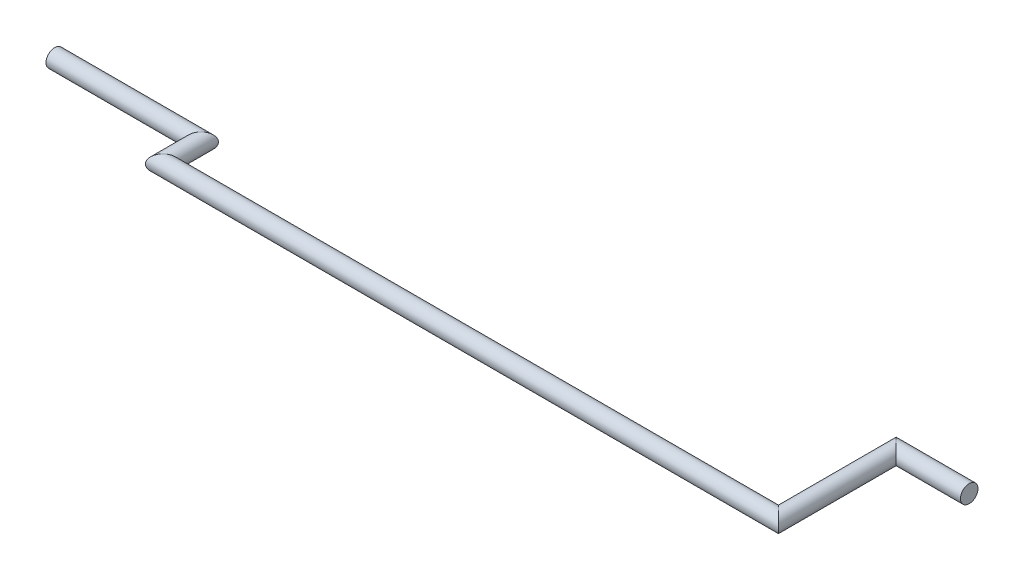
ISO-10303-21;
HEADER;
FILE_DESCRIPTION(('STEP AP214'),'2;1');
FILE_NAME('part.step','',(''),(''),'','','');
FILE_SCHEMA(('AUTOMOTIVE_DESIGN { 1 0 10303 214 1 1 1 1 }'));
ENDSEC;
DATA;
#1=APPLICATION_CONTEXT('core data for automotive mechanical design processes');
#2=APPLICATION_PROTOCOL_DEFINITION('international standard','automotive_design',2000,#1);
#3=PRODUCT_CONTEXT('',#1,'mechanical');
#4=PRODUCT('Part','Part','',(#3));
#5=PRODUCT_RELATED_PRODUCT_CATEGORY('part','',(#4));
#6=PRODUCT_DEFINITION_FORMATION('','',#4);
#7=PRODUCT_DEFINITION_CONTEXT('part definition',#1,'design');
#8=PRODUCT_DEFINITION('design','',#6,#7);
#9=PRODUCT_DEFINITION_SHAPE('','',#8);
#10=(LENGTH_UNIT() NAMED_UNIT(*) SI_UNIT(.MILLI.,.METRE.));
#11=(NAMED_UNIT(*) PLANE_ANGLE_UNIT() SI_UNIT($,.RADIAN.));
#12=(NAMED_UNIT(*) SI_UNIT($,.STERADIAN.) SOLID_ANGLE_UNIT());
#13=UNCERTAINTY_MEASURE_WITH_UNIT(LENGTH_MEASURE(1.E-05),#10,'distance_accuracy_value','');
#14=(GEOMETRIC_REPRESENTATION_CONTEXT(3) GLOBAL_UNCERTAINTY_ASSIGNED_CONTEXT((#13)) GLOBAL_UNIT_ASSIGNED_CONTEXT((#10,
#11,#12)) REPRESENTATION_CONTEXT('',''));
#15=CARTESIAN_POINT('',(0.,0.,0.));
#16=DIRECTION('',(0.,0.,1.));
#17=DIRECTION('',(1.,0.,0.));
#18=AXIS2_PLACEMENT_3D('',#15,#16,#17);
#19=CARTESIAN_POINT('',(47.11,0.,-8.05));
#20=DIRECTION('',(-1.,0.,0.));
#21=DIRECTION('',(0.,0.,1.));
#22=AXIS2_PLACEMENT_3D('',#19,#20,#21);
#23=PLANE('',#22);
#24=CARTESIAN_POINT('',(47.11,0.,-8.05));
#25=DIRECTION('',(-1.,0.,0.));
#26=DIRECTION('',(0.,0.,1.));
#27=AXIS2_PLACEMENT_3D('',#24,#25,#26);
#28=CIRCLE('',#27,0.6);
#29=CARTESIAN_POINT('',(47.11,0.,-7.45));
#30=VERTEX_POINT('',#29);
#31=EDGE_CURVE('E46',#30,#30,#28,.T.);
#32=ORIENTED_EDGE('',*,*,#31,.F.);
#33=EDGE_LOOP('',(#32));
#34=FACE_BOUND('',#33,.T.);
#35=ADVANCED_FACE('F43',(#34),#23,.F.);
#36=CARTESIAN_POINT('',(-10.,0.,-2.59999999999998));
#37=DIRECTION('',(-1.,0.,0.));
#38=DIRECTION('',(0.,0.,1.));
#39=AXIS2_PLACEMENT_3D('',#36,#37,#38);
#40=PLANE('',#39);
#41=CARTESIAN_POINT('',(-10.,0.,-2.59999999999998));
#42=DIRECTION('',(-1.,0.,0.));
#43=DIRECTION('',(0.,0.,1.));
#44=AXIS2_PLACEMENT_3D('',#41,#42,#43);
#45=CIRCLE('',#44,0.6);
#46=CARTESIAN_POINT('',(-10.,0.,-1.99999999999998));
#47=VERTEX_POINT('',#46);
#48=EDGE_CURVE('E49',#47,#47,#45,.T.);
#49=ORIENTED_EDGE('',*,*,#48,.T.);
#50=EDGE_LOOP('',(#49));
#51=FACE_BOUND('',#50,.T.);
#52=ADVANCED_FACE('F75',(#51),#40,.T.);
#53=CARTESIAN_POINT('',(41.35,0.,-8.05));
#54=DIRECTION('',(1.,0.,0.));
#55=DIRECTION('',(0.,0.,-1.));
#56=AXIS2_PLACEMENT_3D('',#53,#54,#55);
#57=CYLINDRICAL_SURFACE('',#56,0.6);
#58=CARTESIAN_POINT('',(42.11,0.,-8.05));
#59=DIRECTION('',(0.707106781186547,0.,-0.707106781186547));
#60=DIRECTION('',(-0.707106781186548,0.,-0.707106781186548));
#61=AXIS2_PLACEMENT_3D('',#58,#59,#60);
#62=ELLIPSE('',#61,0.848528137423857,0.6);
#63=CARTESIAN_POINT('',(41.51,0.,-8.65));
#64=VERTEX_POINT('',#63);
#65=EDGE_CURVE('E65',#64,#64,#62,.T.);
#66=ORIENTED_EDGE('',*,*,#65,.T.);
#67=EDGE_LOOP('',(#66));
#68=FACE_BOUND('',#67,.T.);
#69=ORIENTED_EDGE('',*,*,#31,.T.);
#70=EDGE_LOOP('',(#69));
#71=FACE_BOUND('',#70,.T.);
#72=ADVANCED_FACE('F66',(#68,#71),#57,.T.);
#73=CARTESIAN_POINT('',(42.11,0.,0.760000000000004));
#74=DIRECTION('',(0.,0.,-1.));
#75=DIRECTION('',(-1.,0.,0.));
#76=AXIS2_PLACEMENT_3D('',#73,#74,#75);
#77=CYLINDRICAL_SURFACE('',#76,0.6);
#78=CARTESIAN_POINT('',(42.11,0.,0.));
#79=DIRECTION('',(0.707106781186547,0.,-0.707106781186547));
#80=DIRECTION('',(0.707106781186548,0.,0.707106781186548));
#81=AXIS2_PLACEMENT_3D('',#78,#79,#80);
#82=ELLIPSE('',#81,0.848528137423857,0.6);
#83=CARTESIAN_POINT('',(42.71,0.,0.600000000000009));
#84=VERTEX_POINT('',#83);
#85=EDGE_CURVE('E58',#84,#84,#82,.T.);
#86=ORIENTED_EDGE('',*,*,#85,.T.);
#87=EDGE_LOOP('',(#86));
#88=FACE_BOUND('',#87,.T.);
#89=ORIENTED_EDGE('',*,*,#65,.F.);
#90=EDGE_LOOP('',(#89));
#91=FACE_BOUND('',#90,.T.);
#92=ADVANCED_FACE('F95',(#88,#91),#77,.T.);
#93=CARTESIAN_POINT('',(-0.760000000000018,0.,0.));
#94=DIRECTION('',(1.,0.,0.));
#95=DIRECTION('',(0.,0.,-1.));
#96=AXIS2_PLACEMENT_3D('',#93,#94,#95);
#97=CYLINDRICAL_SURFACE('',#96,0.6);
#98=CARTESIAN_POINT('',(0.,0.,0.));
#99=DIRECTION('',(0.707106781186547,0.,0.707106781186547));
#100=DIRECTION('',(-0.707106781186548,0.,0.707106781186548));
#101=AXIS2_PLACEMENT_3D('',#98,#99,#100);
#102=ELLIPSE('',#101,0.848528137423857,0.6);
#103=CARTESIAN_POINT('',(-0.600000000000009,0.,0.600000000000009));
#104=VERTEX_POINT('',#103);
#105=EDGE_CURVE('E54',#104,#104,#102,.T.);
#106=ORIENTED_EDGE('',*,*,#105,.T.);
#107=EDGE_LOOP('',(#106));
#108=FACE_BOUND('',#107,.T.);
#109=ORIENTED_EDGE('',*,*,#85,.F.);
#110=EDGE_LOOP('',(#109));
#111=FACE_BOUND('',#110,.T.);
#112=ADVANCED_FACE('F83',(#108,#111),#97,.T.);
#113=CARTESIAN_POINT('',(0.,0.,-3.36));
#114=DIRECTION('',(0.,0.,1.));
#115=DIRECTION('',(1.,0.,0.));
#116=AXIS2_PLACEMENT_3D('',#113,#114,#115);
#117=CYLINDRICAL_SURFACE('',#116,0.6);
#118=CARTESIAN_POINT('',(0.,0.,-2.59999999999998));
#119=DIRECTION('',(0.707106781186548,0.,0.707106781186547));
#120=DIRECTION('',(0.707106781186547,0.,-0.707106781186548));
#121=AXIS2_PLACEMENT_3D('',#118,#119,#120);
#122=ELLIPSE('',#121,0.848528137423857,0.6);
#123=CARTESIAN_POINT('',(0.599999999999977,0.,-3.19999999999998));
#124=VERTEX_POINT('',#123);
#125=EDGE_CURVE('E11',#124,#124,#122,.T.);
#126=ORIENTED_EDGE('',*,*,#125,.T.);
#127=EDGE_LOOP('',(#126));
#128=FACE_BOUND('',#127,.T.);
#129=ORIENTED_EDGE('',*,*,#105,.F.);
#130=EDGE_LOOP('',(#129));
#131=FACE_BOUND('',#130,.T.);
#132=ADVANCED_FACE('F76',(#128,#131),#117,.T.);
#133=CARTESIAN_POINT('',(-10.,0.,-2.59999999999998));
#134=DIRECTION('',(1.,0.,0.));
#135=DIRECTION('',(0.,0.,-1.));
#136=AXIS2_PLACEMENT_3D('',#133,#134,#135);
#137=CYLINDRICAL_SURFACE('',#136,0.6);
#138=ORIENTED_EDGE('',*,*,#48,.F.);
#139=EDGE_LOOP('',(#138));
#140=FACE_BOUND('',#139,.T.);
#141=ORIENTED_EDGE('',*,*,#125,.F.);
#142=EDGE_LOOP('',(#141));
#143=FACE_BOUND('',#142,.T.);
#144=ADVANCED_FACE('F80',(#140,#143),#137,.T.);
#145=CLOSED_SHELL('',(#35,#52,#72,#92,#112,#132,#144));
#146=MANIFOLD_SOLID_BREP('B2',#145);
#147=ADVANCED_BREP_SHAPE_REPRESENTATION('',(#18,#146),#14);
#148=SHAPE_DEFINITION_REPRESENTATION(#9,#147);
ENDSEC;
END-ISO-10303-21;
